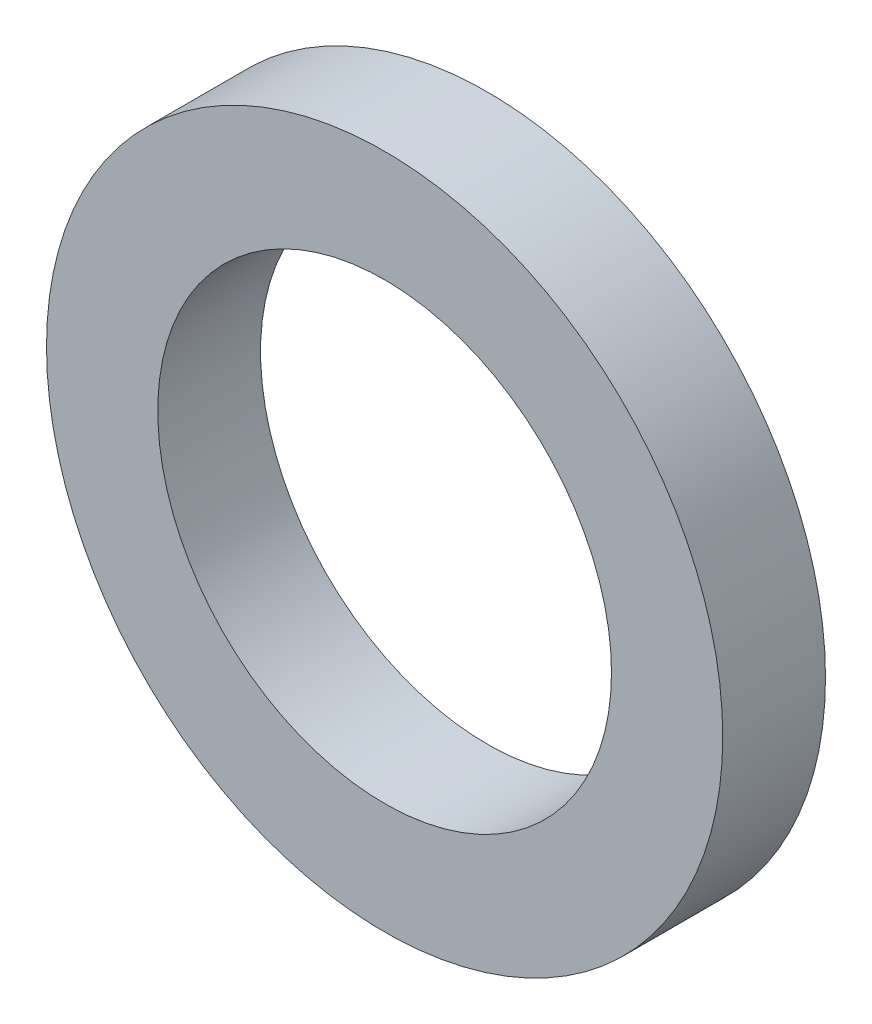
ISO-10303-21;
HEADER;
FILE_DESCRIPTION(('STEP AP214'),'2;1');
FILE_NAME('part.step','',(''),(''),'','','');
FILE_SCHEMA(('AUTOMOTIVE_DESIGN { 1 0 10303 214 1 1 1 1 }'));
ENDSEC;
DATA;
#1=APPLICATION_CONTEXT('core data for automotive mechanical design processes');
#2=APPLICATION_PROTOCOL_DEFINITION('international standard','automotive_design',2000,#1);
#3=PRODUCT_CONTEXT('',#1,'mechanical');
#4=PRODUCT('Part','Part','',(#3));
#5=PRODUCT_RELATED_PRODUCT_CATEGORY('part','',(#4));
#6=PRODUCT_DEFINITION_FORMATION('','',#4);
#7=PRODUCT_DEFINITION_CONTEXT('part definition',#1,'design');
#8=PRODUCT_DEFINITION('design','',#6,#7);
#9=PRODUCT_DEFINITION_SHAPE('','',#8);
#10=(LENGTH_UNIT() NAMED_UNIT(*) SI_UNIT(.MILLI.,.METRE.));
#11=(NAMED_UNIT(*) PLANE_ANGLE_UNIT() SI_UNIT($,.RADIAN.));
#12=(NAMED_UNIT(*) SI_UNIT($,.STERADIAN.) SOLID_ANGLE_UNIT());
#13=UNCERTAINTY_MEASURE_WITH_UNIT(LENGTH_MEASURE(1.E-05),#10,'distance_accuracy_value','');
#14=(GEOMETRIC_REPRESENTATION_CONTEXT(3) GLOBAL_UNCERTAINTY_ASSIGNED_CONTEXT((#13)) GLOBAL_UNIT_ASSIGNED_CONTEXT((#10,
#11,#12)) REPRESENTATION_CONTEXT('',''));
#15=CARTESIAN_POINT('',(0.,0.,0.));
#16=DIRECTION('',(0.,0.,1.));
#17=DIRECTION('',(1.,0.,0.));
#18=AXIS2_PLACEMENT_3D('',#15,#16,#17);
#19=CARTESIAN_POINT('',(7.62,-54.61,1.9558));
#20=DIRECTION('',(0.,0.,1.));
#21=DIRECTION('',(1.,0.,0.));
#22=AXIS2_PLACEMENT_3D('',#19,#20,#21);
#23=PLANE('',#22);
#24=CARTESIAN_POINT('',(7.62,-54.61,1.9558));
#25=DIRECTION('',(0.,0.,1.));
#26=DIRECTION('',(1.,0.,0.));
#27=AXIS2_PLACEMENT_3D('',#24,#25,#26);
#28=CIRCLE('',#27,6.43616817790642);
#29=CARTESIAN_POINT('',(14.0561681779064,-54.61,1.9558));
#30=VERTEX_POINT('',#29);
#31=EDGE_CURVE('E10',#30,#30,#28,.T.);
#32=ORIENTED_EDGE('',*,*,#31,.T.);
#33=EDGE_LOOP('',(#32));
#34=FACE_BOUND('',#33,.T.);
#35=CARTESIAN_POINT('',(7.62,-54.61,1.9558));
#36=DIRECTION('',(0.,0.,1.));
#37=DIRECTION('',(1.,0.,0.));
#38=AXIS2_PLACEMENT_3D('',#35,#36,#37);
#39=CIRCLE('',#38,4.318);
#40=CARTESIAN_POINT('',(11.938,-54.61,1.9558));
#41=VERTEX_POINT('',#40);
#42=EDGE_CURVE('E42',#41,#41,#39,.T.);
#43=ORIENTED_EDGE('',*,*,#42,.F.);
#44=EDGE_LOOP('',(#43));
#45=FACE_BOUND('',#44,.T.);
#46=ADVANCED_FACE('F31',(#34,#45),#23,.T.);
#47=CARTESIAN_POINT('',(7.62,-54.61,0.));
#48=DIRECTION('',(0.,0.,1.));
#49=DIRECTION('',(1.,0.,0.));
#50=AXIS2_PLACEMENT_3D('',#47,#48,#49);
#51=PLANE('',#50);
#52=CARTESIAN_POINT('',(7.62,-54.61,0.));
#53=DIRECTION('',(0.,0.,1.));
#54=DIRECTION('',(1.,0.,0.));
#55=AXIS2_PLACEMENT_3D('',#52,#53,#54);
#56=CIRCLE('',#55,6.43616817790642);
#57=CARTESIAN_POINT('',(14.0561681779064,-54.61,0.));
#58=VERTEX_POINT('',#57);
#59=EDGE_CURVE('E35',#58,#58,#56,.T.);
#60=ORIENTED_EDGE('',*,*,#59,.F.);
#61=EDGE_LOOP('',(#60));
#62=FACE_BOUND('',#61,.T.);
#63=CARTESIAN_POINT('',(7.62,-54.61,0.));
#64=DIRECTION('',(0.,0.,1.));
#65=DIRECTION('',(1.,0.,0.));
#66=AXIS2_PLACEMENT_3D('',#63,#64,#65);
#67=CIRCLE('',#66,4.318);
#68=CARTESIAN_POINT('',(11.938,-54.61,0.));
#69=VERTEX_POINT('',#68);
#70=EDGE_CURVE('E44',#69,#69,#67,.T.);
#71=ORIENTED_EDGE('',*,*,#70,.T.);
#72=EDGE_LOOP('',(#71));
#73=FACE_BOUND('',#72,.T.);
#74=ADVANCED_FACE('F54',(#62,#73),#51,.F.);
#75=CARTESIAN_POINT('',(7.62,-54.61,1.9558));
#76=DIRECTION('',(0.,0.,-1.));
#77=DIRECTION('',(-1.,0.,0.));
#78=AXIS2_PLACEMENT_3D('',#75,#76,#77);
#79=CYLINDRICAL_SURFACE('',#78,6.43616817790642);
#80=ORIENTED_EDGE('',*,*,#31,.F.);
#81=EDGE_LOOP('',(#80));
#82=FACE_BOUND('',#81,.T.);
#83=ORIENTED_EDGE('',*,*,#59,.T.);
#84=EDGE_LOOP('',(#83));
#85=FACE_BOUND('',#84,.T.);
#86=ADVANCED_FACE('F33',(#82,#85),#79,.T.);
#87=CARTESIAN_POINT('',(7.62,-54.61,1.9558));
#88=DIRECTION('',(0.,0.,-1.));
#89=DIRECTION('',(-1.,0.,0.));
#90=AXIS2_PLACEMENT_3D('',#87,#88,#89);
#91=CYLINDRICAL_SURFACE('',#90,4.318);
#92=ORIENTED_EDGE('',*,*,#42,.T.);
#93=EDGE_LOOP('',(#92));
#94=FACE_BOUND('',#93,.T.);
#95=ORIENTED_EDGE('',*,*,#70,.F.);
#96=EDGE_LOOP('',(#95));
#97=FACE_BOUND('',#96,.T.);
#98=ADVANCED_FACE('F50',(#94,#97),#91,.F.);
#99=CLOSED_SHELL('',(#46,#74,#86,#98));
#100=MANIFOLD_SOLID_BREP('B2',#99);
#101=ADVANCED_BREP_SHAPE_REPRESENTATION('',(#18,#100),#14);
#102=SHAPE_DEFINITION_REPRESENTATION(#9,#101);
ENDSEC;
END-ISO-10303-21;
